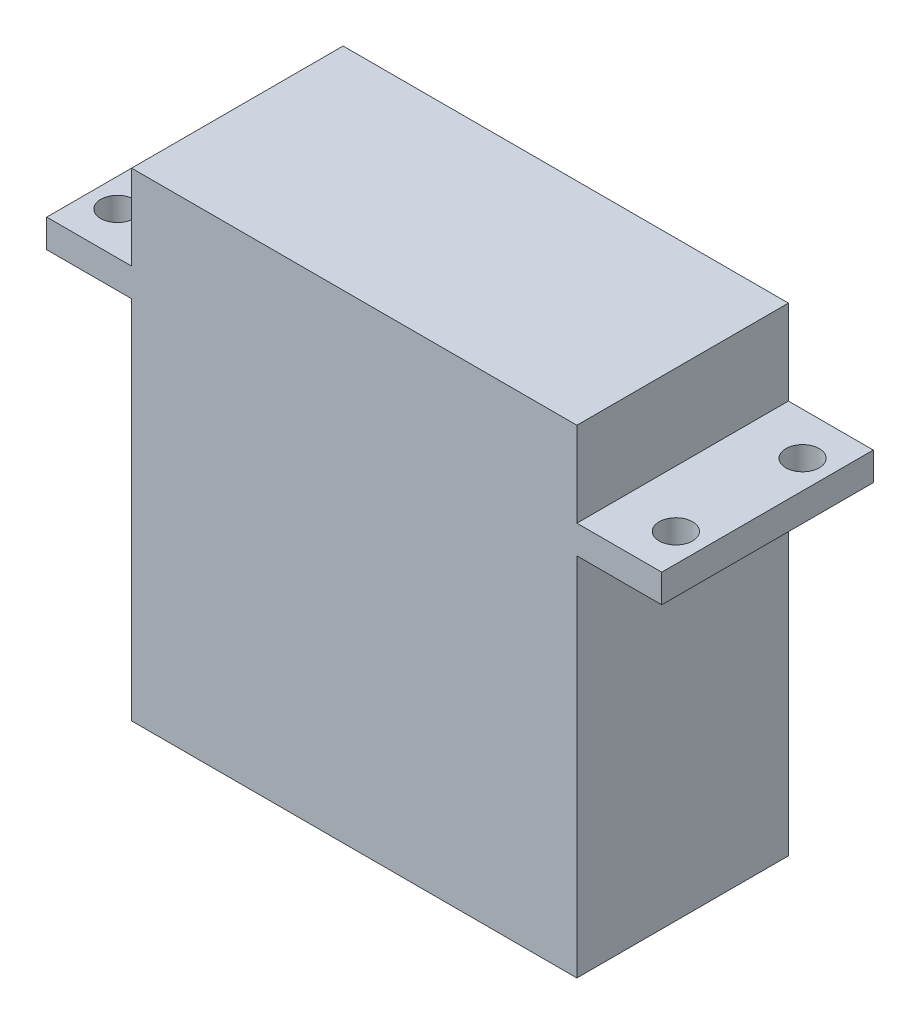
ISO-10303-21;
HEADER;
FILE_DESCRIPTION(('STEP AP214'),'2;1');
FILE_NAME('part.step','',(''),(''),'','','');
FILE_SCHEMA(('AUTOMOTIVE_DESIGN { 1 0 10303 214 1 1 1 1 }'));
ENDSEC;
DATA;
#1=APPLICATION_CONTEXT('core data for automotive mechanical design processes');
#2=APPLICATION_PROTOCOL_DEFINITION('international standard','automotive_design',2000,#1);
#3=PRODUCT_CONTEXT('',#1,'mechanical');
#4=PRODUCT('Part','Part','',(#3));
#5=PRODUCT_RELATED_PRODUCT_CATEGORY('part','',(#4));
#6=PRODUCT_DEFINITION_FORMATION('','',#4);
#7=PRODUCT_DEFINITION_CONTEXT('part definition',#1,'design');
#8=PRODUCT_DEFINITION('design','',#6,#7);
#9=PRODUCT_DEFINITION_SHAPE('','',#8);
#10=(LENGTH_UNIT() NAMED_UNIT(*) SI_UNIT(.MILLI.,.METRE.));
#11=(NAMED_UNIT(*) PLANE_ANGLE_UNIT() SI_UNIT($,.RADIAN.));
#12=(NAMED_UNIT(*) SI_UNIT($,.STERADIAN.) SOLID_ANGLE_UNIT());
#13=UNCERTAINTY_MEASURE_WITH_UNIT(LENGTH_MEASURE(1.E-05),#10,'distance_accuracy_value','');
#14=(GEOMETRIC_REPRESENTATION_CONTEXT(3) GLOBAL_UNCERTAINTY_ASSIGNED_CONTEXT((#13)) GLOBAL_UNIT_ASSIGNED_CONTEXT((#10,
#11,#12)) REPRESENTATION_CONTEXT('',''));
#15=CARTESIAN_POINT('',(0.,0.,0.));
#16=DIRECTION('',(0.,0.,1.));
#17=DIRECTION('',(1.,0.,0.));
#18=AXIS2_PLACEMENT_3D('',#15,#16,#17);
#19=CARTESIAN_POINT('',(0.,0.,19.));
#20=DIRECTION('',(1.,0.,0.));
#21=DIRECTION('',(0.,0.,-1.));
#22=AXIS2_PLACEMENT_3D('',#19,#20,#21);
#23=PLANE('',#22);
#24=DIRECTION('',(0.,0.,-1.));
#25=VECTOR('',#24,1.);
#26=CARTESIAN_POINT('',(0.,35.38,0.));
#27=LINE('',#26,#25);
#28=CARTESIAN_POINT('',(0.,35.38,19.));
#29=VERTEX_POINT('',#28);
#30=CARTESIAN_POINT('',(0.,35.38,0.));
#31=VERTEX_POINT('',#30);
#32=EDGE_CURVE('E50',#29,#31,#27,.T.);
#33=ORIENTED_EDGE('',*,*,#32,.F.);
#34=DIRECTION('',(0.,-1.,0.));
#35=VECTOR('',#34,1.);
#36=CARTESIAN_POINT('',(0.,0.,19.));
#37=LINE('',#36,#35);
#38=CARTESIAN_POINT('',(0.,43.,19.));
#39=VERTEX_POINT('',#38);
#40=EDGE_CURVE('E193',#39,#29,#37,.T.);
#41=ORIENTED_EDGE('',*,*,#40,.F.);
#42=DIRECTION('',(0.,0.,-1.));
#43=VECTOR('',#42,1.);
#44=CARTESIAN_POINT('',(0.,43.,19.));
#45=LINE('',#44,#43);
#46=CARTESIAN_POINT('',(0.,43.,0.));
#47=VERTEX_POINT('',#46);
#48=EDGE_CURVE('E204',#39,#47,#45,.T.);
#49=ORIENTED_EDGE('',*,*,#48,.T.);
#50=DIRECTION('',(0.,-1.,0.));
#51=VECTOR('',#50,1.);
#52=CARTESIAN_POINT('',(0.,0.,0.));
#53=LINE('',#52,#51);
#54=EDGE_CURVE('E205',#47,#31,#53,.T.);
#55=ORIENTED_EDGE('',*,*,#54,.T.);
#56=EDGE_LOOP('',(#33,#41,#49,#55));
#57=FACE_BOUND('',#56,.T.);
#58=ADVANCED_FACE('F36',(#57),#23,.F.);
#59=DIRECTION('',(0.,0.,1.));
#60=VECTOR('',#59,1.);
#61=CARTESIAN_POINT('',(0.,32.84,0.));
#62=LINE('',#61,#60);
#63=CARTESIAN_POINT('',(0.,32.84,0.));
#64=VERTEX_POINT('',#63);
#65=CARTESIAN_POINT('',(0.,32.84,19.));
#66=VERTEX_POINT('',#65);
#67=EDGE_CURVE('E58',#64,#66,#62,.T.);
#68=ORIENTED_EDGE('',*,*,#67,.F.);
#69=CARTESIAN_POINT('',(0.,0.,0.));
#70=VERTEX_POINT('',#69);
#71=EDGE_CURVE('E148',#64,#70,#53,.T.);
#72=ORIENTED_EDGE('',*,*,#71,.T.);
#73=DIRECTION('',(0.,0.,-1.));
#74=VECTOR('',#73,1.);
#75=CARTESIAN_POINT('',(0.,0.,19.));
#76=LINE('',#75,#74);
#77=CARTESIAN_POINT('',(0.,0.,19.));
#78=VERTEX_POINT('',#77);
#79=EDGE_CURVE('E11',#78,#70,#76,.T.);
#80=ORIENTED_EDGE('',*,*,#79,.F.);
#81=EDGE_CURVE('E196',#66,#78,#37,.T.);
#82=ORIENTED_EDGE('',*,*,#81,.F.);
#83=EDGE_LOOP('',(#68,#72,#80,#82));
#84=FACE_BOUND('',#83,.T.);
#85=ADVANCED_FACE('F237',(#84),#23,.F.);
#86=CARTESIAN_POINT('',(40.,0.,19.));
#87=DIRECTION('',(-1.,0.,0.));
#88=DIRECTION('',(0.,0.,1.));
#89=AXIS2_PLACEMENT_3D('',#86,#87,#88);
#90=PLANE('',#89);
#91=DIRECTION('',(0.,0.,1.));
#92=VECTOR('',#91,1.);
#93=CARTESIAN_POINT('',(40.,35.38,19.));
#94=LINE('',#93,#92);
#95=CARTESIAN_POINT('',(40.,35.38,0.));
#96=VERTEX_POINT('',#95);
#97=CARTESIAN_POINT('',(40.,35.38,19.));
#98=VERTEX_POINT('',#97);
#99=EDGE_CURVE('E171',#96,#98,#94,.T.);
#100=ORIENTED_EDGE('',*,*,#99,.F.);
#101=DIRECTION('',(0.,1.,0.));
#102=VECTOR('',#101,1.);
#103=CARTESIAN_POINT('',(40.,0.,0.));
#104=LINE('',#103,#102);
#105=CARTESIAN_POINT('',(40.,43.,0.));
#106=VERTEX_POINT('',#105);
#107=EDGE_CURVE('E209',#96,#106,#104,.T.);
#108=ORIENTED_EDGE('',*,*,#107,.T.);
#109=DIRECTION('',(0.,0.,-1.));
#110=VECTOR('',#109,1.);
#111=CARTESIAN_POINT('',(40.,43.,19.));
#112=LINE('',#111,#110);
#113=CARTESIAN_POINT('',(40.,43.,19.));
#114=VERTEX_POINT('',#113);
#115=EDGE_CURVE('E216',#114,#106,#112,.T.);
#116=ORIENTED_EDGE('',*,*,#115,.F.);
#117=DIRECTION('',(0.,1.,0.));
#118=VECTOR('',#117,1.);
#119=CARTESIAN_POINT('',(40.,0.,19.));
#120=LINE('',#119,#118);
#121=EDGE_CURVE('E198',#98,#114,#120,.T.);
#122=ORIENTED_EDGE('',*,*,#121,.F.);
#123=EDGE_LOOP('',(#100,#108,#116,#122));
#124=FACE_BOUND('',#123,.T.);
#125=ADVANCED_FACE('F257',(#124),#90,.F.);
#126=DIRECTION('',(0.,0.,-1.));
#127=VECTOR('',#126,1.);
#128=CARTESIAN_POINT('',(40.,32.84,19.));
#129=LINE('',#128,#127);
#130=CARTESIAN_POINT('',(40.,32.84,19.));
#131=VERTEX_POINT('',#130);
#132=CARTESIAN_POINT('',(40.,32.84,0.));
#133=VERTEX_POINT('',#132);
#134=EDGE_CURVE('E166',#131,#133,#129,.T.);
#135=ORIENTED_EDGE('',*,*,#134,.F.);
#136=CARTESIAN_POINT('',(40.,0.,19.));
#137=VERTEX_POINT('',#136);
#138=EDGE_CURVE('E199',#137,#131,#120,.T.);
#139=ORIENTED_EDGE('',*,*,#138,.F.);
#140=DIRECTION('',(0.,0.,-1.));
#141=VECTOR('',#140,1.);
#142=CARTESIAN_POINT('',(40.,0.,19.));
#143=LINE('',#142,#141);
#144=CARTESIAN_POINT('',(40.,0.,0.));
#145=VERTEX_POINT('',#144);
#146=EDGE_CURVE('E43',#137,#145,#143,.T.);
#147=ORIENTED_EDGE('',*,*,#146,.T.);
#148=EDGE_CURVE('E210',#145,#133,#104,.T.);
#149=ORIENTED_EDGE('',*,*,#148,.T.);
#150=EDGE_LOOP('',(#135,#139,#147,#149));
#151=FACE_BOUND('',#150,.T.);
#152=ADVANCED_FACE('F223',(#151),#90,.F.);
#153=CARTESIAN_POINT('',(0.,0.,19.));
#154=DIRECTION('',(0.,1.,0.));
#155=DIRECTION('',(0.,0.,1.));
#156=AXIS2_PLACEMENT_3D('',#153,#154,#155);
#157=PLANE('',#156);
#158=DIRECTION('',(1.,0.,0.));
#159=VECTOR('',#158,1.);
#160=CARTESIAN_POINT('',(0.,0.,0.));
#161=LINE('',#160,#159);
#162=EDGE_CURVE('E207',#70,#145,#161,.T.);
#163=ORIENTED_EDGE('',*,*,#162,.T.);
#164=ORIENTED_EDGE('',*,*,#146,.F.);
#165=DIRECTION('',(1.,0.,0.));
#166=VECTOR('',#165,1.);
#167=CARTESIAN_POINT('',(0.,0.,19.));
#168=LINE('',#167,#166);
#169=EDGE_CURVE('E195',#78,#137,#168,.T.);
#170=ORIENTED_EDGE('',*,*,#169,.F.);
#171=ORIENTED_EDGE('',*,*,#79,.T.);
#172=EDGE_LOOP('',(#163,#164,#170,#171));
#173=FACE_BOUND('',#172,.T.);
#174=ADVANCED_FACE('F236',(#173),#157,.F.);
#175=CARTESIAN_POINT('',(0.,43.,19.));
#176=DIRECTION('',(0.,-1.,0.));
#177=DIRECTION('',(0.,0.,-1.));
#178=AXIS2_PLACEMENT_3D('',#175,#176,#177);
#179=PLANE('',#178);
#180=DIRECTION('',(-1.,0.,0.));
#181=VECTOR('',#180,1.);
#182=CARTESIAN_POINT('',(0.,43.,0.));
#183=LINE('',#182,#181);
#184=EDGE_CURVE('E212',#106,#47,#183,.T.);
#185=ORIENTED_EDGE('',*,*,#184,.T.);
#186=ORIENTED_EDGE('',*,*,#48,.F.);
#187=DIRECTION('',(-1.,0.,0.));
#188=VECTOR('',#187,1.);
#189=CARTESIAN_POINT('',(0.,43.,19.));
#190=LINE('',#189,#188);
#191=EDGE_CURVE('E202',#114,#39,#190,.T.);
#192=ORIENTED_EDGE('',*,*,#191,.F.);
#193=ORIENTED_EDGE('',*,*,#115,.T.);
#194=EDGE_LOOP('',(#185,#186,#192,#193));
#195=FACE_BOUND('',#194,.T.);
#196=ADVANCED_FACE('F254',(#195),#179,.F.);
#197=CARTESIAN_POINT('',(0.,0.,19.));
#198=DIRECTION('',(0.,0.,-1.));
#199=DIRECTION('',(-1.,0.,0.));
#200=AXIS2_PLACEMENT_3D('',#197,#198,#199);
#201=PLANE('',#200);
#202=ORIENTED_EDGE('',*,*,#40,.T.);
#203=DIRECTION('',(1.,0.,0.));
#204=VECTOR('',#203,1.);
#205=CARTESIAN_POINT('',(-7.62,35.38,19.));
#206=LINE('',#205,#204);
#207=CARTESIAN_POINT('',(-7.62,35.38,19.));
#208=VERTEX_POINT('',#207);
#209=EDGE_CURVE('E154',#208,#29,#206,.T.);
#210=ORIENTED_EDGE('',*,*,#209,.F.);
#211=DIRECTION('',(0.,1.,0.));
#212=VECTOR('',#211,1.);
#213=CARTESIAN_POINT('',(-7.62,35.38,19.));
#214=LINE('',#213,#212);
#215=CARTESIAN_POINT('',(-7.62,32.84,19.));
#216=VERTEX_POINT('',#215);
#217=EDGE_CURVE('E134',#216,#208,#214,.T.);
#218=ORIENTED_EDGE('',*,*,#217,.F.);
#219=DIRECTION('',(1.,0.,0.));
#220=VECTOR('',#219,1.);
#221=CARTESIAN_POINT('',(-7.62,32.84,19.));
#222=LINE('',#221,#220);
#223=EDGE_CURVE('E131',#216,#66,#222,.T.);
#224=ORIENTED_EDGE('',*,*,#223,.T.);
#225=ORIENTED_EDGE('',*,*,#81,.T.);
#226=ORIENTED_EDGE('',*,*,#169,.T.);
#227=ORIENTED_EDGE('',*,*,#138,.T.);
#228=DIRECTION('',(-1.,0.,0.));
#229=VECTOR('',#228,1.);
#230=CARTESIAN_POINT('',(47.62,32.84,19.));
#231=LINE('',#230,#229);
#232=CARTESIAN_POINT('',(47.62,32.84,19.));
#233=VERTEX_POINT('',#232);
#234=EDGE_CURVE('E190',#233,#131,#231,.T.);
#235=ORIENTED_EDGE('',*,*,#234,.F.);
#236=DIRECTION('',(0.,-1.,0.));
#237=VECTOR('',#236,1.);
#238=CARTESIAN_POINT('',(47.62,35.38,19.));
#239=LINE('',#238,#237);
#240=CARTESIAN_POINT('',(47.62,35.38,19.));
#241=VERTEX_POINT('',#240);
#242=EDGE_CURVE('E167',#241,#233,#239,.T.);
#243=ORIENTED_EDGE('',*,*,#242,.F.);
#244=DIRECTION('',(-1.,0.,0.));
#245=VECTOR('',#244,1.);
#246=CARTESIAN_POINT('',(47.62,35.38,19.));
#247=LINE('',#246,#245);
#248=EDGE_CURVE('E177',#241,#98,#247,.T.);
#249=ORIENTED_EDGE('',*,*,#248,.T.);
#250=ORIENTED_EDGE('',*,*,#121,.T.);
#251=ORIENTED_EDGE('',*,*,#191,.T.);
#252=EDGE_LOOP('',(#202,#210,#218,#224,#225,#226,#227,#235,#243,#249,#250,#251));
#253=FACE_BOUND('',#252,.T.);
#254=ADVANCED_FACE('F233',(#253),#201,.F.);
#255=CARTESIAN_POINT('',(0.,0.,0.));
#256=DIRECTION('',(0.,0.,-1.));
#257=DIRECTION('',(-1.,0.,0.));
#258=AXIS2_PLACEMENT_3D('',#255,#256,#257);
#259=PLANE('',#258);
#260=ORIENTED_EDGE('',*,*,#54,.F.);
#261=ORIENTED_EDGE('',*,*,#184,.F.);
#262=ORIENTED_EDGE('',*,*,#107,.F.);
#263=DIRECTION('',(-1.,0.,0.));
#264=VECTOR('',#263,1.);
#265=CARTESIAN_POINT('',(47.62,35.38,0.));
#266=LINE('',#265,#264);
#267=CARTESIAN_POINT('',(47.62,35.38,0.));
#268=VERTEX_POINT('',#267);
#269=EDGE_CURVE('E184',#268,#96,#266,.T.);
#270=ORIENTED_EDGE('',*,*,#269,.F.);
#271=DIRECTION('',(0.,1.,0.));
#272=VECTOR('',#271,1.);
#273=CARTESIAN_POINT('',(47.62,35.38,0.));
#274=LINE('',#273,#272);
#275=CARTESIAN_POINT('',(47.62,32.84,0.));
#276=VERTEX_POINT('',#275);
#277=EDGE_CURVE('E173',#276,#268,#274,.T.);
#278=ORIENTED_EDGE('',*,*,#277,.F.);
#279=DIRECTION('',(-1.,0.,0.));
#280=VECTOR('',#279,1.);
#281=CARTESIAN_POINT('',(47.62,32.84,0.));
#282=LINE('',#281,#280);
#283=EDGE_CURVE('E187',#276,#133,#282,.T.);
#284=ORIENTED_EDGE('',*,*,#283,.T.);
#285=ORIENTED_EDGE('',*,*,#148,.F.);
#286=ORIENTED_EDGE('',*,*,#162,.F.);
#287=ORIENTED_EDGE('',*,*,#71,.F.);
#288=DIRECTION('',(1.,0.,0.));
#289=VECTOR('',#288,1.);
#290=CARTESIAN_POINT('',(-7.62,32.84,0.));
#291=LINE('',#290,#289);
#292=CARTESIAN_POINT('',(-7.62,32.84,0.));
#293=VERTEX_POINT('',#292);
#294=EDGE_CURVE('E129',#293,#64,#291,.T.);
#295=ORIENTED_EDGE('',*,*,#294,.F.);
#296=DIRECTION('',(0.,-1.,0.));
#297=VECTOR('',#296,1.);
#298=CARTESIAN_POINT('',(-7.62,35.38,0.));
#299=LINE('',#298,#297);
#300=CARTESIAN_POINT('',(-7.62,35.38,0.));
#301=VERTEX_POINT('',#300);
#302=EDGE_CURVE('E135',#301,#293,#299,.T.);
#303=ORIENTED_EDGE('',*,*,#302,.F.);
#304=DIRECTION('',(1.,0.,0.));
#305=VECTOR('',#304,1.);
#306=CARTESIAN_POINT('',(-7.62,35.38,0.));
#307=LINE('',#306,#305);
#308=EDGE_CURVE('E243',#301,#31,#307,.T.);
#309=ORIENTED_EDGE('',*,*,#308,.T.);
#310=EDGE_LOOP('',(#260,#261,#262,#270,#278,#284,#285,#286,#287,#295,#303,#309));
#311=FACE_BOUND('',#310,.T.);
#312=ADVANCED_FACE('F146',(#311),#259,.T.);
#313=CARTESIAN_POINT('',(47.62,32.84,19.));
#314=DIRECTION('',(0.,1.,0.));
#315=DIRECTION('',(0.,0.,1.));
#316=AXIS2_PLACEMENT_3D('',#313,#314,#315);
#317=PLANE('',#316);
#318=CARTESIAN_POINT('',(45.08,32.84,3.81));
#319=DIRECTION('',(0.,1.,0.));
#320=DIRECTION('',(0.,0.,1.));
#321=AXIS2_PLACEMENT_3D('',#318,#319,#320);
#322=CIRCLE('',#321,1.5);
#323=CARTESIAN_POINT('',(45.08,32.84,5.31));
#324=VERTEX_POINT('',#323);
#325=EDGE_CURVE('E163',#324,#324,#322,.T.);
#326=ORIENTED_EDGE('',*,*,#325,.T.);
#327=EDGE_LOOP('',(#326));
#328=FACE_BOUND('',#327,.T.);
#329=CARTESIAN_POINT('',(45.08,32.84,15.19));
#330=DIRECTION('',(0.,1.,0.));
#331=DIRECTION('',(0.,0.,1.));
#332=AXIS2_PLACEMENT_3D('',#329,#330,#331);
#333=CIRCLE('',#332,1.5);
#334=CARTESIAN_POINT('',(45.08,32.84,16.69));
#335=VERTEX_POINT('',#334);
#336=EDGE_CURVE('E159',#335,#335,#333,.T.);
#337=ORIENTED_EDGE('',*,*,#336,.T.);
#338=EDGE_LOOP('',(#337));
#339=FACE_BOUND('',#338,.T.);
#340=ORIENTED_EDGE('',*,*,#134,.T.);
#341=ORIENTED_EDGE('',*,*,#283,.F.);
#342=DIRECTION('',(0.,0.,-1.));
#343=VECTOR('',#342,1.);
#344=CARTESIAN_POINT('',(47.62,32.84,19.));
#345=LINE('',#344,#343);
#346=EDGE_CURVE('E170',#233,#276,#345,.T.);
#347=ORIENTED_EDGE('',*,*,#346,.F.);
#348=ORIENTED_EDGE('',*,*,#234,.T.);
#349=EDGE_LOOP('',(#340,#341,#347,#348));
#350=FACE_BOUND('',#349,.T.);
#351=ADVANCED_FACE('F230',(#328,#339,#350),#317,.F.);
#352=CARTESIAN_POINT('',(47.62,35.38,19.));
#353=DIRECTION('',(0.,-1.,0.));
#354=DIRECTION('',(0.,0.,-1.));
#355=AXIS2_PLACEMENT_3D('',#352,#353,#354);
#356=PLANE('',#355);
#357=CARTESIAN_POINT('',(45.08,35.38,3.81));
#358=DIRECTION('',(0.,1.,0.));
#359=DIRECTION('',(0.,0.,1.));
#360=AXIS2_PLACEMENT_3D('',#357,#358,#359);
#361=CIRCLE('',#360,1.5);
#362=CARTESIAN_POINT('',(45.08,35.38,5.31));
#363=VERTEX_POINT('',#362);
#364=EDGE_CURVE('E152',#363,#363,#361,.T.);
#365=ORIENTED_EDGE('',*,*,#364,.F.);
#366=EDGE_LOOP('',(#365));
#367=FACE_BOUND('',#366,.T.);
#368=CARTESIAN_POINT('',(45.08,35.38,15.19));
#369=DIRECTION('',(0.,1.,0.));
#370=DIRECTION('',(0.,0.,1.));
#371=AXIS2_PLACEMENT_3D('',#368,#369,#370);
#372=CIRCLE('',#371,1.5);
#373=CARTESIAN_POINT('',(45.08,35.38,16.69));
#374=VERTEX_POINT('',#373);
#375=EDGE_CURVE('E149',#374,#374,#372,.T.);
#376=ORIENTED_EDGE('',*,*,#375,.F.);
#377=EDGE_LOOP('',(#376));
#378=FACE_BOUND('',#377,.T.);
#379=ORIENTED_EDGE('',*,*,#99,.T.);
#380=ORIENTED_EDGE('',*,*,#248,.F.);
#381=DIRECTION('',(0.,0.,1.));
#382=VECTOR('',#381,1.);
#383=CARTESIAN_POINT('',(47.62,35.38,19.));
#384=LINE('',#383,#382);
#385=EDGE_CURVE('E175',#268,#241,#384,.T.);
#386=ORIENTED_EDGE('',*,*,#385,.F.);
#387=ORIENTED_EDGE('',*,*,#269,.T.);
#388=EDGE_LOOP('',(#379,#380,#386,#387));
#389=FACE_BOUND('',#388,.T.);
#390=ADVANCED_FACE('F260',(#367,#378,#389),#356,.F.);
#391=CARTESIAN_POINT('',(47.62,0.,0.));
#392=DIRECTION('',(1.,0.,0.));
#393=DIRECTION('',(0.,0.,-1.));
#394=AXIS2_PLACEMENT_3D('',#391,#392,#393);
#395=PLANE('',#394);
#396=ORIENTED_EDGE('',*,*,#242,.T.);
#397=ORIENTED_EDGE('',*,*,#346,.T.);
#398=ORIENTED_EDGE('',*,*,#277,.T.);
#399=ORIENTED_EDGE('',*,*,#385,.T.);
#400=EDGE_LOOP('',(#396,#397,#398,#399));
#401=FACE_BOUND('',#400,.T.);
#402=ADVANCED_FACE('F263',(#401),#395,.T.);
#403=CARTESIAN_POINT('',(45.08,0.,15.19));
#404=DIRECTION('',(0.,1.,0.));
#405=DIRECTION('',(0.,0.,1.));
#406=AXIS2_PLACEMENT_3D('',#403,#404,#405);
#407=CYLINDRICAL_SURFACE('',#406,1.5);
#408=ORIENTED_EDGE('',*,*,#375,.T.);
#409=EDGE_LOOP('',(#408));
#410=FACE_BOUND('',#409,.T.);
#411=ORIENTED_EDGE('',*,*,#336,.F.);
#412=EDGE_LOOP('',(#411));
#413=FACE_BOUND('',#412,.T.);
#414=ADVANCED_FACE('F265',(#410,#413),#407,.F.);
#415=CARTESIAN_POINT('',(45.08,0.,3.81));
#416=DIRECTION('',(0.,1.,0.));
#417=DIRECTION('',(0.,0.,1.));
#418=AXIS2_PLACEMENT_3D('',#415,#416,#417);
#419=CYLINDRICAL_SURFACE('',#418,1.5);
#420=ORIENTED_EDGE('',*,*,#364,.T.);
#421=EDGE_LOOP('',(#420));
#422=FACE_BOUND('',#421,.T.);
#423=ORIENTED_EDGE('',*,*,#325,.F.);
#424=EDGE_LOOP('',(#423));
#425=FACE_BOUND('',#424,.T.);
#426=ADVANCED_FACE('F271',(#422,#425),#419,.F.);
#427=CARTESIAN_POINT('',(-7.62,32.84,0.));
#428=DIRECTION('',(0.,1.,0.));
#429=DIRECTION('',(0.,0.,1.));
#430=AXIS2_PLACEMENT_3D('',#427,#428,#429);
#431=PLANE('',#430);
#432=CARTESIAN_POINT('',(-5.08,32.84,3.81));
#433=DIRECTION('',(0.,1.,0.));
#434=DIRECTION('',(0.,0.,1.));
#435=AXIS2_PLACEMENT_3D('',#432,#433,#434);
#436=CIRCLE('',#435,1.5);
#437=CARTESIAN_POINT('',(-5.08,32.84,5.31));
#438=VERTEX_POINT('',#437);
#439=EDGE_CURVE('E238',#438,#438,#436,.T.);
#440=ORIENTED_EDGE('',*,*,#439,.T.);
#441=EDGE_LOOP('',(#440));
#442=FACE_BOUND('',#441,.T.);
#443=CARTESIAN_POINT('',(-5.08,32.84,15.19));
#444=DIRECTION('',(0.,1.,0.));
#445=DIRECTION('',(0.,0.,1.));
#446=AXIS2_PLACEMENT_3D('',#443,#444,#445);
#447=CIRCLE('',#446,1.5);
#448=CARTESIAN_POINT('',(-5.08,32.84,16.69));
#449=VERTEX_POINT('',#448);
#450=EDGE_CURVE('E339',#449,#449,#447,.T.);
#451=ORIENTED_EDGE('',*,*,#450,.T.);
#452=EDGE_LOOP('',(#451));
#453=FACE_BOUND('',#452,.T.);
#454=ORIENTED_EDGE('',*,*,#67,.T.);
#455=ORIENTED_EDGE('',*,*,#223,.F.);
#456=DIRECTION('',(0.,0.,1.));
#457=VECTOR('',#456,1.);
#458=CARTESIAN_POINT('',(-7.62,32.84,0.));
#459=LINE('',#458,#457);
#460=EDGE_CURVE('E125',#293,#216,#459,.T.);
#461=ORIENTED_EDGE('',*,*,#460,.F.);
#462=ORIENTED_EDGE('',*,*,#294,.T.);
#463=EDGE_LOOP('',(#454,#455,#461,#462));
#464=FACE_BOUND('',#463,.T.);
#465=ADVANCED_FACE('F127',(#442,#453,#464),#431,.F.);
#466=CARTESIAN_POINT('',(-7.62,35.38,0.));
#467=DIRECTION('',(0.,-1.,0.));
#468=DIRECTION('',(0.,0.,-1.));
#469=AXIS2_PLACEMENT_3D('',#466,#467,#468);
#470=PLANE('',#469);
#471=CARTESIAN_POINT('',(-5.08,35.38,3.81));
#472=DIRECTION('',(0.,1.,0.));
#473=DIRECTION('',(0.,0.,1.));
#474=AXIS2_PLACEMENT_3D('',#471,#472,#473);
#475=CIRCLE('',#474,1.5);
#476=CARTESIAN_POINT('',(-5.08,35.38,5.31));
#477=VERTEX_POINT('',#476);
#478=EDGE_CURVE('E336',#477,#477,#475,.T.);
#479=ORIENTED_EDGE('',*,*,#478,.F.);
#480=EDGE_LOOP('',(#479));
#481=FACE_BOUND('',#480,.T.);
#482=CARTESIAN_POINT('',(-5.08,35.38,15.19));
#483=DIRECTION('',(0.,1.,0.));
#484=DIRECTION('',(0.,0.,1.));
#485=AXIS2_PLACEMENT_3D('',#482,#483,#484);
#486=CIRCLE('',#485,1.5);
#487=CARTESIAN_POINT('',(-5.08,35.38,16.69));
#488=VERTEX_POINT('',#487);
#489=EDGE_CURVE('E344',#488,#488,#486,.T.);
#490=ORIENTED_EDGE('',*,*,#489,.F.);
#491=EDGE_LOOP('',(#490));
#492=FACE_BOUND('',#491,.T.);
#493=ORIENTED_EDGE('',*,*,#32,.T.);
#494=ORIENTED_EDGE('',*,*,#308,.F.);
#495=DIRECTION('',(0.,0.,-1.));
#496=VECTOR('',#495,1.);
#497=CARTESIAN_POINT('',(-7.62,35.38,0.));
#498=LINE('',#497,#496);
#499=EDGE_CURVE('E140',#208,#301,#498,.T.);
#500=ORIENTED_EDGE('',*,*,#499,.F.);
#501=ORIENTED_EDGE('',*,*,#209,.T.);
#502=EDGE_LOOP('',(#493,#494,#500,#501));
#503=FACE_BOUND('',#502,.T.);
#504=ADVANCED_FACE('F248',(#481,#492,#503),#470,.F.);
#505=CARTESIAN_POINT('',(-7.62,0.,0.));
#506=DIRECTION('',(-1.,0.,0.));
#507=DIRECTION('',(0.,0.,1.));
#508=AXIS2_PLACEMENT_3D('',#505,#506,#507);
#509=PLANE('',#508);
#510=ORIENTED_EDGE('',*,*,#302,.T.);
#511=ORIENTED_EDGE('',*,*,#460,.T.);
#512=ORIENTED_EDGE('',*,*,#217,.T.);
#513=ORIENTED_EDGE('',*,*,#499,.T.);
#514=EDGE_LOOP('',(#510,#511,#512,#513));
#515=FACE_BOUND('',#514,.T.);
#516=ADVANCED_FACE('F138',(#515),#509,.T.);
#517=CARTESIAN_POINT('',(-5.08,0.,15.19));
#518=DIRECTION('',(0.,1.,0.));
#519=DIRECTION('',(0.,0.,1.));
#520=AXIS2_PLACEMENT_3D('',#517,#518,#519);
#521=CYLINDRICAL_SURFACE('',#520,1.5);
#522=ORIENTED_EDGE('',*,*,#489,.T.);
#523=EDGE_LOOP('',(#522));
#524=FACE_BOUND('',#523,.T.);
#525=ORIENTED_EDGE('',*,*,#450,.F.);
#526=EDGE_LOOP('',(#525));
#527=FACE_BOUND('',#526,.T.);
#528=ADVANCED_FACE('F324',(#524,#527),#521,.F.);
#529=CARTESIAN_POINT('',(-5.08,0.,3.81));
#530=DIRECTION('',(0.,1.,0.));
#531=DIRECTION('',(0.,0.,1.));
#532=AXIS2_PLACEMENT_3D('',#529,#530,#531);
#533=CYLINDRICAL_SURFACE('',#532,1.5);
#534=ORIENTED_EDGE('',*,*,#478,.T.);
#535=EDGE_LOOP('',(#534));
#536=FACE_BOUND('',#535,.T.);
#537=ORIENTED_EDGE('',*,*,#439,.F.);
#538=EDGE_LOOP('',(#537));
#539=FACE_BOUND('',#538,.T.);
#540=ADVANCED_FACE('F327',(#536,#539),#533,.F.);
#541=CLOSED_SHELL('',(#58,#85,#125,#152,#174,#196,#254,#312,#351,#390,#402,#414,#426,#465,#504,
#516,#528,#540));
#542=MANIFOLD_SOLID_BREP('B2',#541);
#543=ADVANCED_BREP_SHAPE_REPRESENTATION('',(#18,#542),#14);
#544=SHAPE_DEFINITION_REPRESENTATION(#9,#543);
ENDSEC;
END-ISO-10303-21;
